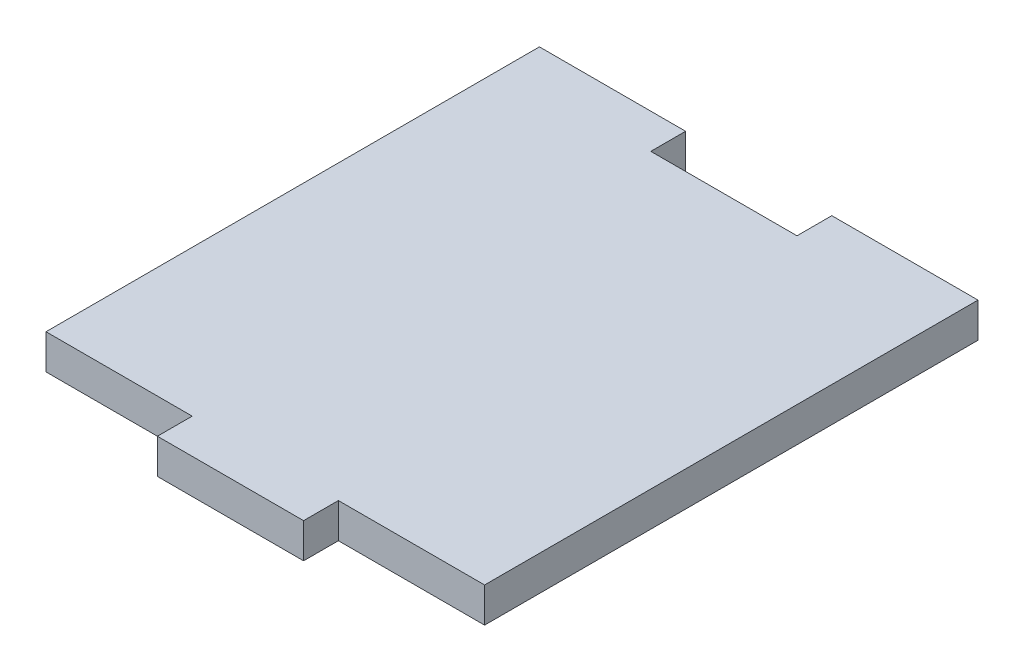
ISO-10303-21;
HEADER;
FILE_DESCRIPTION(('STEP AP214'),'2;1');
FILE_NAME('part.step','',(''),(''),'','','');
FILE_SCHEMA(('AUTOMOTIVE_DESIGN { 1 0 10303 214 1 1 1 1 }'));
ENDSEC;
DATA;
#1=APPLICATION_CONTEXT('core data for automotive mechanical design processes');
#2=APPLICATION_PROTOCOL_DEFINITION('international standard','automotive_design',2000,#1);
#3=PRODUCT_CONTEXT('',#1,'mechanical');
#4=PRODUCT('Part','Part','',(#3));
#5=PRODUCT_RELATED_PRODUCT_CATEGORY('part','',(#4));
#6=PRODUCT_DEFINITION_FORMATION('','',#4);
#7=PRODUCT_DEFINITION_CONTEXT('part definition',#1,'design');
#8=PRODUCT_DEFINITION('design','',#6,#7);
#9=PRODUCT_DEFINITION_SHAPE('','',#8);
#10=(LENGTH_UNIT() NAMED_UNIT(*) SI_UNIT(.MILLI.,.METRE.));
#11=(NAMED_UNIT(*) PLANE_ANGLE_UNIT() SI_UNIT($,.RADIAN.));
#12=(NAMED_UNIT(*) SI_UNIT($,.STERADIAN.) SOLID_ANGLE_UNIT());
#13=UNCERTAINTY_MEASURE_WITH_UNIT(LENGTH_MEASURE(1.E-05),#10,'distance_accuracy_value','');
#14=(GEOMETRIC_REPRESENTATION_CONTEXT(3) GLOBAL_UNCERTAINTY_ASSIGNED_CONTEXT((#13)) GLOBAL_UNIT_ASSIGNED_CONTEXT((#10,
#11,#12)) REPRESENTATION_CONTEXT('',''));
#15=CARTESIAN_POINT('',(0.,0.,0.));
#16=DIRECTION('',(0.,0.,1.));
#17=DIRECTION('',(1.,0.,0.));
#18=AXIS2_PLACEMENT_3D('',#15,#16,#17);
#19=CARTESIAN_POINT('',(0.,3.175,0.));
#20=DIRECTION('',(1.,0.,0.));
#21=DIRECTION('',(0.,0.,-1.));
#22=AXIS2_PLACEMENT_3D('',#19,#20,#21);
#23=PLANE('',#22);
#24=DIRECTION('',(0.,0.,1.));
#25=VECTOR('',#24,1.);
#26=CARTESIAN_POINT('',(0.,0.,0.));
#27=LINE('',#26,#25);
#28=CARTESIAN_POINT('',(0.,0.,-45.));
#29=VERTEX_POINT('',#28);
#30=CARTESIAN_POINT('',(0.,0.,0.));
#31=VERTEX_POINT('',#30);
#32=EDGE_CURVE('E153',#29,#31,#27,.T.);
#33=ORIENTED_EDGE('',*,*,#32,.T.);
#34=DIRECTION('',(0.,-1.,0.));
#35=VECTOR('',#34,1.);
#36=CARTESIAN_POINT('',(0.,3.175,0.));
#37=LINE('',#36,#35);
#38=CARTESIAN_POINT('',(0.,3.175,0.));
#39=VERTEX_POINT('',#38);
#40=EDGE_CURVE('E11',#39,#31,#37,.T.);
#41=ORIENTED_EDGE('',*,*,#40,.F.);
#42=DIRECTION('',(0.,0.,1.));
#43=VECTOR('',#42,1.);
#44=CARTESIAN_POINT('',(0.,3.175,0.));
#45=LINE('',#44,#43);
#46=CARTESIAN_POINT('',(0.,3.175,-45.));
#47=VERTEX_POINT('',#46);
#48=EDGE_CURVE('E175',#47,#39,#45,.T.);
#49=ORIENTED_EDGE('',*,*,#48,.F.);
#50=DIRECTION('',(0.,-1.,0.));
#51=VECTOR('',#50,1.);
#52=CARTESIAN_POINT('',(0.,3.175,-45.));
#53=LINE('',#52,#51);
#54=EDGE_CURVE('E149',#47,#29,#53,.T.);
#55=ORIENTED_EDGE('',*,*,#54,.T.);
#56=EDGE_LOOP('',(#33,#41,#49,#55));
#57=FACE_BOUND('',#56,.T.);
#58=ADVANCED_FACE('F33',(#57),#23,.F.);
#59=CARTESIAN_POINT('',(0.,3.175,0.));
#60=DIRECTION('',(0.,0.,-1.));
#61=DIRECTION('',(-1.,0.,0.));
#62=AXIS2_PLACEMENT_3D('',#59,#60,#61);
#63=PLANE('',#62);
#64=DIRECTION('',(1.,0.,0.));
#65=VECTOR('',#64,1.);
#66=CARTESIAN_POINT('',(0.,0.,0.));
#67=LINE('',#66,#65);
#68=CARTESIAN_POINT('',(13.3333333333333,0.,0.));
#69=VERTEX_POINT('',#68);
#70=EDGE_CURVE('E156',#31,#69,#67,.T.);
#71=ORIENTED_EDGE('',*,*,#70,.T.);
#72=DIRECTION('',(0.,-1.,0.));
#73=VECTOR('',#72,1.);
#74=CARTESIAN_POINT('',(13.3333333333333,3.175,0.));
#75=LINE('',#74,#73);
#76=CARTESIAN_POINT('',(13.3333333333333,3.175,0.));
#77=VERTEX_POINT('',#76);
#78=EDGE_CURVE('E41',#77,#69,#75,.T.);
#79=ORIENTED_EDGE('',*,*,#78,.F.);
#80=DIRECTION('',(1.,0.,0.));
#81=VECTOR('',#80,1.);
#82=CARTESIAN_POINT('',(0.,3.175,0.));
#83=LINE('',#82,#81);
#84=EDGE_CURVE('E104',#39,#77,#83,.T.);
#85=ORIENTED_EDGE('',*,*,#84,.F.);
#86=ORIENTED_EDGE('',*,*,#40,.T.);
#87=EDGE_LOOP('',(#71,#79,#85,#86));
#88=FACE_BOUND('',#87,.T.);
#89=ADVANCED_FACE('F253',(#88),#63,.F.);
#90=CARTESIAN_POINT('',(13.3333333333333,3.175,0.));
#91=DIRECTION('',(1.,0.,0.));
#92=DIRECTION('',(0.,0.,-1.));
#93=AXIS2_PLACEMENT_3D('',#90,#91,#92);
#94=PLANE('',#93);
#95=DIRECTION('',(0.,0.,1.));
#96=VECTOR('',#95,1.);
#97=CARTESIAN_POINT('',(13.3333333333333,0.,0.));
#98=LINE('',#97,#96);
#99=CARTESIAN_POINT('',(13.3333333333333,0.,3.175));
#100=VERTEX_POINT('',#99);
#101=EDGE_CURVE('E158',#69,#100,#98,.T.);
#102=ORIENTED_EDGE('',*,*,#101,.T.);
#103=DIRECTION('',(0.,-1.,0.));
#104=VECTOR('',#103,1.);
#105=CARTESIAN_POINT('',(13.3333333333333,3.175,3.175));
#106=LINE('',#105,#104);
#107=CARTESIAN_POINT('',(13.3333333333333,3.175,3.175));
#108=VERTEX_POINT('',#107);
#109=EDGE_CURVE('E194',#108,#100,#106,.T.);
#110=ORIENTED_EDGE('',*,*,#109,.F.);
#111=DIRECTION('',(0.,0.,1.));
#112=VECTOR('',#111,1.);
#113=CARTESIAN_POINT('',(13.3333333333333,3.175,0.));
#114=LINE('',#113,#112);
#115=EDGE_CURVE('E202',#77,#108,#114,.T.);
#116=ORIENTED_EDGE('',*,*,#115,.F.);
#117=ORIENTED_EDGE('',*,*,#78,.T.);
#118=EDGE_LOOP('',(#102,#110,#116,#117));
#119=FACE_BOUND('',#118,.T.);
#120=ADVANCED_FACE('F200',(#119),#94,.F.);
#121=CARTESIAN_POINT('',(13.3333333333333,3.175,3.175));
#122=DIRECTION('',(0.,0.,-1.));
#123=DIRECTION('',(-1.,0.,0.));
#124=AXIS2_PLACEMENT_3D('',#121,#122,#123);
#125=PLANE('',#124);
#126=DIRECTION('',(1.,0.,0.));
#127=VECTOR('',#126,1.);
#128=CARTESIAN_POINT('',(13.3333333333333,0.,3.175));
#129=LINE('',#128,#127);
#130=CARTESIAN_POINT('',(26.6666666666667,0.,3.175));
#131=VERTEX_POINT('',#130);
#132=EDGE_CURVE('E160',#100,#131,#129,.T.);
#133=ORIENTED_EDGE('',*,*,#132,.T.);
#134=DIRECTION('',(0.,-1.,0.));
#135=VECTOR('',#134,1.);
#136=CARTESIAN_POINT('',(26.6666666666667,3.175,3.175));
#137=LINE('',#136,#135);
#138=CARTESIAN_POINT('',(26.6666666666667,3.175,3.175));
#139=VERTEX_POINT('',#138);
#140=EDGE_CURVE('E191',#139,#131,#137,.T.);
#141=ORIENTED_EDGE('',*,*,#140,.F.);
#142=DIRECTION('',(1.,0.,0.));
#143=VECTOR('',#142,1.);
#144=CARTESIAN_POINT('',(13.3333333333333,3.175,3.175));
#145=LINE('',#144,#143);
#146=EDGE_CURVE('E220',#108,#139,#145,.T.);
#147=ORIENTED_EDGE('',*,*,#146,.F.);
#148=ORIENTED_EDGE('',*,*,#109,.T.);
#149=EDGE_LOOP('',(#133,#141,#147,#148));
#150=FACE_BOUND('',#149,.T.);
#151=ADVANCED_FACE('F211',(#150),#125,.F.);
#152=CARTESIAN_POINT('',(26.6666666666667,3.175,3.175));
#153=DIRECTION('',(-1.,0.,0.));
#154=DIRECTION('',(0.,0.,1.));
#155=AXIS2_PLACEMENT_3D('',#152,#153,#154);
#156=PLANE('',#155);
#157=DIRECTION('',(0.,0.,-1.));
#158=VECTOR('',#157,1.);
#159=CARTESIAN_POINT('',(26.6666666666667,0.,3.175));
#160=LINE('',#159,#158);
#161=CARTESIAN_POINT('',(26.6666666666667,0.,0.));
#162=VERTEX_POINT('',#161);
#163=EDGE_CURVE('E162',#131,#162,#160,.T.);
#164=ORIENTED_EDGE('',*,*,#163,.T.);
#165=DIRECTION('',(0.,-1.,0.));
#166=VECTOR('',#165,1.);
#167=CARTESIAN_POINT('',(26.6666666666667,3.175,0.));
#168=LINE('',#167,#166);
#169=CARTESIAN_POINT('',(26.6666666666667,3.175,0.));
#170=VERTEX_POINT('',#169);
#171=EDGE_CURVE('E188',#170,#162,#168,.T.);
#172=ORIENTED_EDGE('',*,*,#171,.F.);
#173=DIRECTION('',(0.,0.,-1.));
#174=VECTOR('',#173,1.);
#175=CARTESIAN_POINT('',(26.6666666666667,3.175,3.175));
#176=LINE('',#175,#174);
#177=EDGE_CURVE('E217',#139,#170,#176,.T.);
#178=ORIENTED_EDGE('',*,*,#177,.F.);
#179=ORIENTED_EDGE('',*,*,#140,.T.);
#180=EDGE_LOOP('',(#164,#172,#178,#179));
#181=FACE_BOUND('',#180,.T.);
#182=ADVANCED_FACE('F215',(#181),#156,.F.);
#183=CARTESIAN_POINT('',(26.6666666666667,3.175,0.));
#184=DIRECTION('',(0.,0.,-1.));
#185=DIRECTION('',(-1.,0.,0.));
#186=AXIS2_PLACEMENT_3D('',#183,#184,#185);
#187=PLANE('',#186);
#188=DIRECTION('',(1.,0.,0.));
#189=VECTOR('',#188,1.);
#190=CARTESIAN_POINT('',(26.6666666666667,0.,0.));
#191=LINE('',#190,#189);
#192=CARTESIAN_POINT('',(40.,0.,0.));
#193=VERTEX_POINT('',#192);
#194=EDGE_CURVE('E164',#162,#193,#191,.T.);
#195=ORIENTED_EDGE('',*,*,#194,.T.);
#196=DIRECTION('',(0.,-1.,0.));
#197=VECTOR('',#196,1.);
#198=CARTESIAN_POINT('',(40.,3.175,0.));
#199=LINE('',#198,#197);
#200=CARTESIAN_POINT('',(40.,3.175,0.));
#201=VERTEX_POINT('',#200);
#202=EDGE_CURVE('E185',#201,#193,#199,.T.);
#203=ORIENTED_EDGE('',*,*,#202,.F.);
#204=DIRECTION('',(1.,0.,0.));
#205=VECTOR('',#204,1.);
#206=CARTESIAN_POINT('',(26.6666666666667,3.175,0.));
#207=LINE('',#206,#205);
#208=EDGE_CURVE('E219',#170,#201,#207,.T.);
#209=ORIENTED_EDGE('',*,*,#208,.F.);
#210=ORIENTED_EDGE('',*,*,#171,.T.);
#211=EDGE_LOOP('',(#195,#203,#209,#210));
#212=FACE_BOUND('',#211,.T.);
#213=ADVANCED_FACE('F266',(#212),#187,.F.);
#214=CARTESIAN_POINT('',(40.,3.175,0.));
#215=DIRECTION('',(-1.,0.,0.));
#216=DIRECTION('',(0.,0.,1.));
#217=AXIS2_PLACEMENT_3D('',#214,#215,#216);
#218=PLANE('',#217);
#219=DIRECTION('',(0.,0.,-1.));
#220=VECTOR('',#219,1.);
#221=CARTESIAN_POINT('',(40.,0.,0.));
#222=LINE('',#221,#220);
#223=CARTESIAN_POINT('',(40.,0.,-45.));
#224=VERTEX_POINT('',#223);
#225=EDGE_CURVE('E166',#193,#224,#222,.T.);
#226=ORIENTED_EDGE('',*,*,#225,.T.);
#227=DIRECTION('',(0.,-1.,0.));
#228=VECTOR('',#227,1.);
#229=CARTESIAN_POINT('',(40.,3.175,-45.));
#230=LINE('',#229,#228);
#231=CARTESIAN_POINT('',(40.,3.175,-45.));
#232=VERTEX_POINT('',#231);
#233=EDGE_CURVE('E182',#232,#224,#230,.T.);
#234=ORIENTED_EDGE('',*,*,#233,.F.);
#235=DIRECTION('',(0.,0.,-1.));
#236=VECTOR('',#235,1.);
#237=CARTESIAN_POINT('',(40.,3.175,0.));
#238=LINE('',#237,#236);
#239=EDGE_CURVE('E222',#201,#232,#238,.T.);
#240=ORIENTED_EDGE('',*,*,#239,.F.);
#241=ORIENTED_EDGE('',*,*,#202,.T.);
#242=EDGE_LOOP('',(#226,#234,#240,#241));
#243=FACE_BOUND('',#242,.T.);
#244=ADVANCED_FACE('F269',(#243),#218,.F.);
#245=CARTESIAN_POINT('',(26.6666666666667,3.175,-45.));
#246=DIRECTION('',(0.,0.,1.));
#247=DIRECTION('',(1.,0.,0.));
#248=AXIS2_PLACEMENT_3D('',#245,#246,#247);
#249=PLANE('',#248);
#250=DIRECTION('',(-1.,0.,0.));
#251=VECTOR('',#250,1.);
#252=CARTESIAN_POINT('',(26.6666666666667,0.,-45.));
#253=LINE('',#252,#251);
#254=CARTESIAN_POINT('',(26.6666666666667,0.,-45.));
#255=VERTEX_POINT('',#254);
#256=EDGE_CURVE('E168',#224,#255,#253,.T.);
#257=ORIENTED_EDGE('',*,*,#256,.T.);
#258=DIRECTION('',(0.,-1.,0.));
#259=VECTOR('',#258,1.);
#260=CARTESIAN_POINT('',(26.6666666666667,3.175,-45.));
#261=LINE('',#260,#259);
#262=CARTESIAN_POINT('',(26.6666666666667,3.175,-45.));
#263=VERTEX_POINT('',#262);
#264=EDGE_CURVE('E179',#263,#255,#261,.T.);
#265=ORIENTED_EDGE('',*,*,#264,.F.);
#266=DIRECTION('',(-1.,0.,0.));
#267=VECTOR('',#266,1.);
#268=CARTESIAN_POINT('',(26.6666666666667,3.175,-45.));
#269=LINE('',#268,#267);
#270=EDGE_CURVE('E228',#232,#263,#269,.T.);
#271=ORIENTED_EDGE('',*,*,#270,.F.);
#272=ORIENTED_EDGE('',*,*,#233,.T.);
#273=EDGE_LOOP('',(#257,#265,#271,#272));
#274=FACE_BOUND('',#273,.T.);
#275=ADVANCED_FACE('F234',(#274),#249,.F.);
#276=CARTESIAN_POINT('',(26.6666666666667,3.175,-41.825));
#277=DIRECTION('',(1.,0.,0.));
#278=DIRECTION('',(0.,0.,-1.));
#279=AXIS2_PLACEMENT_3D('',#276,#277,#278);
#280=PLANE('',#279);
#281=DIRECTION('',(0.,0.,1.));
#282=VECTOR('',#281,1.);
#283=CARTESIAN_POINT('',(26.6666666666667,0.,-41.825));
#284=LINE('',#283,#282);
#285=CARTESIAN_POINT('',(26.6666666666667,0.,-41.825));
#286=VERTEX_POINT('',#285);
#287=EDGE_CURVE('E170',#255,#286,#284,.T.);
#288=ORIENTED_EDGE('',*,*,#287,.T.);
#289=DIRECTION('',(0.,-1.,0.));
#290=VECTOR('',#289,1.);
#291=CARTESIAN_POINT('',(26.6666666666667,3.175,-41.825));
#292=LINE('',#291,#290);
#293=CARTESIAN_POINT('',(26.6666666666667,3.175,-41.825));
#294=VERTEX_POINT('',#293);
#295=EDGE_CURVE('E144',#294,#286,#292,.T.);
#296=ORIENTED_EDGE('',*,*,#295,.F.);
#297=DIRECTION('',(0.,0.,1.));
#298=VECTOR('',#297,1.);
#299=CARTESIAN_POINT('',(26.6666666666667,3.175,-41.825));
#300=LINE('',#299,#298);
#301=EDGE_CURVE('E135',#263,#294,#300,.T.);
#302=ORIENTED_EDGE('',*,*,#301,.F.);
#303=ORIENTED_EDGE('',*,*,#264,.T.);
#304=EDGE_LOOP('',(#288,#296,#302,#303));
#305=FACE_BOUND('',#304,.T.);
#306=ADVANCED_FACE('F238',(#305),#280,.F.);
#307=CARTESIAN_POINT('',(13.3333333333333,3.175,-41.825));
#308=DIRECTION('',(0.,0.,1.));
#309=DIRECTION('',(1.,0.,0.));
#310=AXIS2_PLACEMENT_3D('',#307,#308,#309);
#311=PLANE('',#310);
#312=DIRECTION('',(-1.,0.,0.));
#313=VECTOR('',#312,1.);
#314=CARTESIAN_POINT('',(13.3333333333333,0.,-41.825));
#315=LINE('',#314,#313);
#316=CARTESIAN_POINT('',(13.3333333333333,0.,-41.825));
#317=VERTEX_POINT('',#316);
#318=EDGE_CURVE('E143',#286,#317,#315,.T.);
#319=ORIENTED_EDGE('',*,*,#318,.T.);
#320=DIRECTION('',(0.,-1.,0.));
#321=VECTOR('',#320,1.);
#322=CARTESIAN_POINT('',(13.3333333333333,3.175,-41.825));
#323=LINE('',#322,#321);
#324=CARTESIAN_POINT('',(13.3333333333333,3.175,-41.825));
#325=VERTEX_POINT('',#324);
#326=EDGE_CURVE('E140',#325,#317,#323,.T.);
#327=ORIENTED_EDGE('',*,*,#326,.F.);
#328=DIRECTION('',(-1.,0.,0.));
#329=VECTOR('',#328,1.);
#330=CARTESIAN_POINT('',(13.3333333333333,3.175,-41.825));
#331=LINE('',#330,#329);
#332=EDGE_CURVE('E129',#294,#325,#331,.T.);
#333=ORIENTED_EDGE('',*,*,#332,.F.);
#334=ORIENTED_EDGE('',*,*,#295,.T.);
#335=EDGE_LOOP('',(#319,#327,#333,#334));
#336=FACE_BOUND('',#335,.T.);
#337=ADVANCED_FACE('F141',(#336),#311,.F.);
#338=CARTESIAN_POINT('',(13.3333333333333,3.175,-45.));
#339=DIRECTION('',(-1.,0.,0.));
#340=DIRECTION('',(0.,0.,1.));
#341=AXIS2_PLACEMENT_3D('',#338,#339,#340);
#342=PLANE('',#341);
#343=DIRECTION('',(0.,0.,-1.));
#344=VECTOR('',#343,1.);
#345=CARTESIAN_POINT('',(13.3333333333333,0.,-45.));
#346=LINE('',#345,#344);
#347=CARTESIAN_POINT('',(13.3333333333333,0.,-45.));
#348=VERTEX_POINT('',#347);
#349=EDGE_CURVE('E90',#317,#348,#346,.T.);
#350=ORIENTED_EDGE('',*,*,#349,.T.);
#351=DIRECTION('',(0.,-1.,0.));
#352=VECTOR('',#351,1.);
#353=CARTESIAN_POINT('',(13.3333333333333,3.175,-45.));
#354=LINE('',#353,#352);
#355=CARTESIAN_POINT('',(13.3333333333333,3.175,-45.));
#356=VERTEX_POINT('',#355);
#357=EDGE_CURVE('E145',#356,#348,#354,.T.);
#358=ORIENTED_EDGE('',*,*,#357,.F.);
#359=DIRECTION('',(0.,0.,-1.));
#360=VECTOR('',#359,1.);
#361=CARTESIAN_POINT('',(13.3333333333333,3.175,-45.));
#362=LINE('',#361,#360);
#363=EDGE_CURVE('E133',#325,#356,#362,.T.);
#364=ORIENTED_EDGE('',*,*,#363,.F.);
#365=ORIENTED_EDGE('',*,*,#326,.T.);
#366=EDGE_LOOP('',(#350,#358,#364,#365));
#367=FACE_BOUND('',#366,.T.);
#368=ADVANCED_FACE('F147',(#367),#342,.F.);
#369=CARTESIAN_POINT('',(0.,3.175,-45.));
#370=DIRECTION('',(0.,0.,1.));
#371=DIRECTION('',(1.,0.,0.));
#372=AXIS2_PLACEMENT_3D('',#369,#370,#371);
#373=PLANE('',#372);
#374=DIRECTION('',(-1.,0.,0.));
#375=VECTOR('',#374,1.);
#376=CARTESIAN_POINT('',(0.,0.,-45.));
#377=LINE('',#376,#375);
#378=EDGE_CURVE('E96',#348,#29,#377,.T.);
#379=ORIENTED_EDGE('',*,*,#378,.T.);
#380=ORIENTED_EDGE('',*,*,#54,.F.);
#381=DIRECTION('',(-1.,0.,0.));
#382=VECTOR('',#381,1.);
#383=CARTESIAN_POINT('',(0.,3.175,-45.));
#384=LINE('',#383,#382);
#385=EDGE_CURVE('E49',#356,#47,#384,.T.);
#386=ORIENTED_EDGE('',*,*,#385,.F.);
#387=ORIENTED_EDGE('',*,*,#357,.T.);
#388=EDGE_LOOP('',(#379,#380,#386,#387));
#389=FACE_BOUND('',#388,.T.);
#390=ADVANCED_FACE('F242',(#389),#373,.F.);
#391=CARTESIAN_POINT('',(0.,3.175,0.));
#392=DIRECTION('',(0.,-1.,0.));
#393=DIRECTION('',(0.,0.,-1.));
#394=AXIS2_PLACEMENT_3D('',#391,#392,#393);
#395=PLANE('',#394);
#396=ORIENTED_EDGE('',*,*,#48,.T.);
#397=ORIENTED_EDGE('',*,*,#84,.T.);
#398=ORIENTED_EDGE('',*,*,#115,.T.);
#399=ORIENTED_EDGE('',*,*,#146,.T.);
#400=ORIENTED_EDGE('',*,*,#177,.T.);
#401=ORIENTED_EDGE('',*,*,#208,.T.);
#402=ORIENTED_EDGE('',*,*,#239,.T.);
#403=ORIENTED_EDGE('',*,*,#270,.T.);
#404=ORIENTED_EDGE('',*,*,#301,.T.);
#405=ORIENTED_EDGE('',*,*,#332,.T.);
#406=ORIENTED_EDGE('',*,*,#363,.T.);
#407=ORIENTED_EDGE('',*,*,#385,.T.);
#408=EDGE_LOOP('',(#396,#397,#398,#399,#400,#401,#402,#403,#404,#405,#406,#407));
#409=FACE_BOUND('',#408,.T.);
#410=ADVANCED_FACE('F131',(#409),#395,.F.);
#411=CARTESIAN_POINT('',(0.,0.,0.));
#412=DIRECTION('',(0.,-1.,0.));
#413=DIRECTION('',(0.,0.,-1.));
#414=AXIS2_PLACEMENT_3D('',#411,#412,#413);
#415=PLANE('',#414);
#416=ORIENTED_EDGE('',*,*,#32,.F.);
#417=ORIENTED_EDGE('',*,*,#378,.F.);
#418=ORIENTED_EDGE('',*,*,#349,.F.);
#419=ORIENTED_EDGE('',*,*,#318,.F.);
#420=ORIENTED_EDGE('',*,*,#287,.F.);
#421=ORIENTED_EDGE('',*,*,#256,.F.);
#422=ORIENTED_EDGE('',*,*,#225,.F.);
#423=ORIENTED_EDGE('',*,*,#194,.F.);
#424=ORIENTED_EDGE('',*,*,#163,.F.);
#425=ORIENTED_EDGE('',*,*,#132,.F.);
#426=ORIENTED_EDGE('',*,*,#101,.F.);
#427=ORIENTED_EDGE('',*,*,#70,.F.);
#428=EDGE_LOOP('',(#416,#417,#418,#419,#420,#421,#422,#423,#424,#425,#426,#427));
#429=FACE_BOUND('',#428,.T.);
#430=ADVANCED_FACE('F206',(#429),#415,.T.);
#431=CLOSED_SHELL('',(#58,#89,#120,#151,#182,#213,#244,#275,#306,#337,#368,#390,#410,#430));
#432=MANIFOLD_SOLID_BREP('B2',#431);
#433=ADVANCED_BREP_SHAPE_REPRESENTATION('',(#18,#432),#14);
#434=SHAPE_DEFINITION_REPRESENTATION(#9,#433);
ENDSEC;
END-ISO-10303-21;
